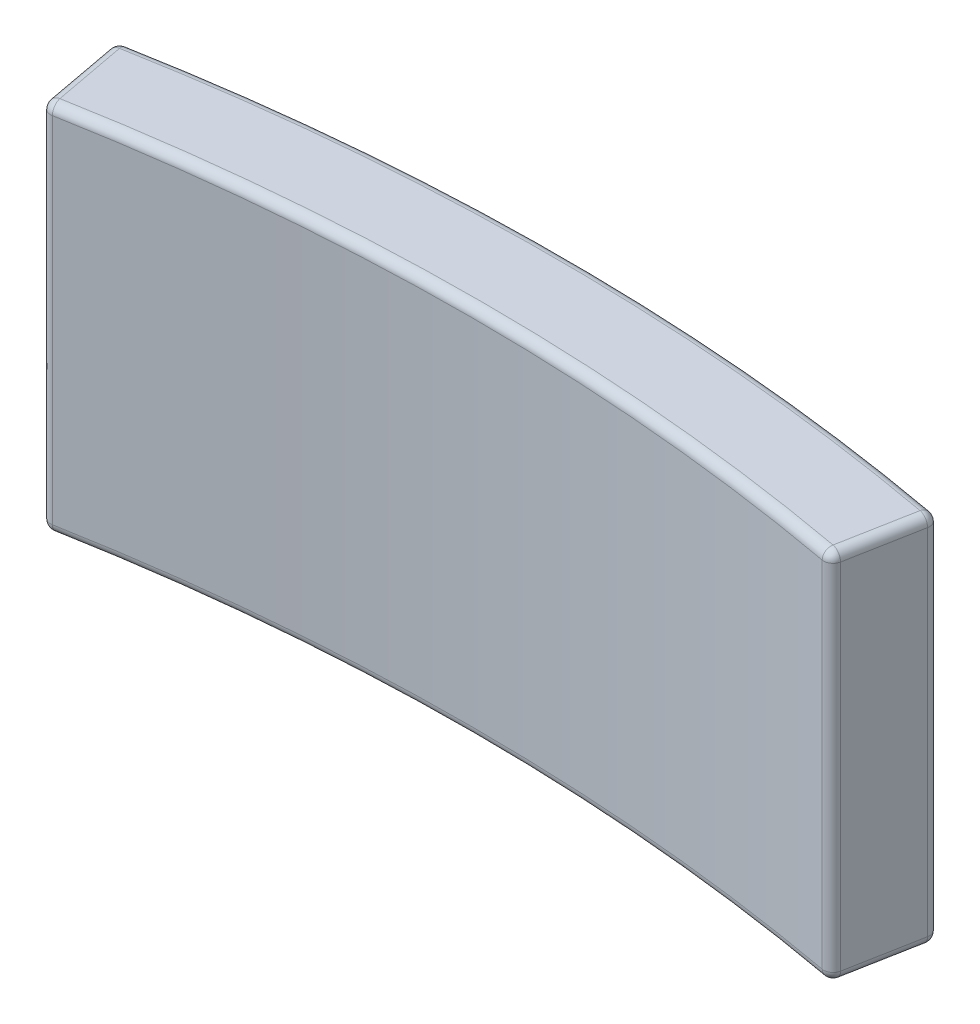
ISO-10303-21;
HEADER;
FILE_DESCRIPTION(('STEP AP214'),'2;1');
FILE_NAME('part.step','',(''),(''),'','','');
FILE_SCHEMA(('AUTOMOTIVE_DESIGN { 1 0 10303 214 1 1 1 1 }'));
ENDSEC;
DATA;
#1=APPLICATION_CONTEXT('core data for automotive mechanical design processes');
#2=APPLICATION_PROTOCOL_DEFINITION('international standard','automotive_design',2000,#1);
#3=PRODUCT_CONTEXT('',#1,'mechanical');
#4=PRODUCT('Part','Part','',(#3));
#5=PRODUCT_RELATED_PRODUCT_CATEGORY('part','',(#4));
#6=PRODUCT_DEFINITION_FORMATION('','',#4);
#7=PRODUCT_DEFINITION_CONTEXT('part definition',#1,'design');
#8=PRODUCT_DEFINITION('design','',#6,#7);
#9=PRODUCT_DEFINITION_SHAPE('','',#8);
#10=(LENGTH_UNIT() NAMED_UNIT(*) SI_UNIT(.MILLI.,.METRE.));
#11=(NAMED_UNIT(*) PLANE_ANGLE_UNIT() SI_UNIT($,.RADIAN.));
#12=(NAMED_UNIT(*) SI_UNIT($,.STERADIAN.) SOLID_ANGLE_UNIT());
#13=UNCERTAINTY_MEASURE_WITH_UNIT(LENGTH_MEASURE(1.E-05),#10,'distance_accuracy_value','');
#14=(GEOMETRIC_REPRESENTATION_CONTEXT(3) GLOBAL_UNCERTAINTY_ASSIGNED_CONTEXT((#13)) GLOBAL_UNIT_ASSIGNED_CONTEXT((#10,
#11,#12)) REPRESENTATION_CONTEXT('',''));
#15=CARTESIAN_POINT('',(0.,0.,0.));
#16=DIRECTION('',(0.,0.,1.));
#17=DIRECTION('',(1.,0.,0.));
#18=AXIS2_PLACEMENT_3D('',#15,#16,#17);
#19=CARTESIAN_POINT('',(0.,2.,0.));
#20=DIRECTION('',(0.,-1.,0.));
#21=DIRECTION('',(0.,0.,-1.));
#22=AXIS2_PLACEMENT_3D('',#19,#20,#21);
#23=CYLINDRICAL_SURFACE('',#22,24.);
#24=CARTESIAN_POINT('',(0.,1.9,0.));
#25=DIRECTION('',(0.,1.,0.));
#26=DIRECTION('',(0.,0.,1.));
#27=AXIS2_PLACEMENT_3D('',#24,#25,#26);
#28=CIRCLE('',#27,24.);
#29=CARTESIAN_POINT('',(-4.31124122948053,1.9,-23.6095997225965));
#30=VERTEX_POINT('',#29);
#31=CARTESIAN_POINT('',(4.31124122948052,1.9,-23.6095997225965));
#32=VERTEX_POINT('',#31);
#33=EDGE_CURVE('E41',#30,#32,#28,.F.);
#34=ORIENTED_EDGE('',*,*,#33,.T.);
#35=DIRECTION('',(0.,-1.,0.));
#36=VECTOR('',#35,1.);
#37=CARTESIAN_POINT('',(4.31124122948052,2.,-23.6095997225965));
#38=LINE('',#37,#36);
#39=CARTESIAN_POINT('',(4.31124122948052,-1.9,-23.6095997225965));
#40=VERTEX_POINT('',#39);
#41=EDGE_CURVE('E11',#32,#40,#38,.T.);
#42=ORIENTED_EDGE('',*,*,#41,.T.);
#43=CARTESIAN_POINT('',(0.,-1.9,0.));
#44=DIRECTION('',(0.,1.,0.));
#45=DIRECTION('',(0.,0.,1.));
#46=AXIS2_PLACEMENT_3D('',#43,#44,#45);
#47=CIRCLE('',#46,24.);
#48=CARTESIAN_POINT('',(-4.31124122948053,-1.9,-23.6095997225965));
#49=VERTEX_POINT('',#48);
#50=EDGE_CURVE('E244',#40,#49,#47,.T.);
#51=ORIENTED_EDGE('',*,*,#50,.T.);
#52=DIRECTION('',(0.,-1.,0.));
#53=VECTOR('',#52,1.);
#54=CARTESIAN_POINT('',(-4.31124122948053,2.,-23.6095997225965));
#55=LINE('',#54,#53);
#56=EDGE_CURVE('E52',#49,#30,#55,.F.);
#57=ORIENTED_EDGE('',*,*,#56,.T.);
#58=EDGE_LOOP('',(#34,#42,#51,#57));
#59=FACE_BOUND('',#58,.T.);
#60=ADVANCED_FACE('F32',(#59),#23,.T.);
#61=CARTESIAN_POINT('',(-4.22623890978113,2.,-22.6083812927297));
#62=DIRECTION('',(0.982973099683901,0.,-0.183749517816575));
#63=DIRECTION('',(-0.183749517816575,0.,-0.982973099683901));
#64=AXIS2_PLACEMENT_3D('',#61,#62,#63);
#65=PLANE('',#64);
#66=DIRECTION('',(0.183749517816575,0.,0.982973099683901));
#67=VECTOR('',#66,1.);
#68=CARTESIAN_POINT('',(-4.22623890978113,-1.9,-22.6083812927297));
#69=LINE('',#68,#67);
#70=CARTESIAN_POINT('',(-4.39157503432608,-1.9,-23.4928514386373));
#71=VERTEX_POINT('',#70);
#72=CARTESIAN_POINT('',(-4.24457408875354,-1.9,-22.7064658369611));
#73=VERTEX_POINT('',#72);
#74=EDGE_CURVE('E217',#71,#73,#69,.T.);
#75=ORIENTED_EDGE('',*,*,#74,.T.);
#76=DIRECTION('',(0.,-1.,0.));
#77=VECTOR('',#76,1.);
#78=CARTESIAN_POINT('',(-4.24457408875354,2.,-22.7064658369611));
#79=LINE('',#78,#77);
#80=CARTESIAN_POINT('',(-4.24457408875354,1.9,-22.7064658369611));
#81=VERTEX_POINT('',#80);
#82=EDGE_CURVE('E225',#73,#81,#79,.F.);
#83=ORIENTED_EDGE('',*,*,#82,.T.);
#84=DIRECTION('',(0.183749517816575,0.,0.982973099683901));
#85=VECTOR('',#84,1.);
#86=CARTESIAN_POINT('',(-4.40998842759771,1.9,-23.5913543924136));
#87=LINE('',#86,#85);
#88=CARTESIAN_POINT('',(-4.39157503432608,1.9,-23.4928514386373));
#89=VERTEX_POINT('',#88);
#90=EDGE_CURVE('E214',#81,#89,#87,.F.);
#91=ORIENTED_EDGE('',*,*,#90,.T.);
#92=DIRECTION('',(0.,-1.,0.));
#93=VECTOR('',#92,1.);
#94=CARTESIAN_POINT('',(-4.39157503432608,2.,-23.4928514386373));
#95=LINE('',#94,#93);
#96=EDGE_CURVE('E211',#89,#71,#95,.T.);
#97=ORIENTED_EDGE('',*,*,#96,.T.);
#98=EDGE_LOOP('',(#75,#83,#91,#97));
#99=FACE_BOUND('',#98,.T.);
#100=ADVANCED_FACE('F328',(#99),#65,.F.);
#101=CARTESIAN_POINT('',(0.,2.,0.));
#102=DIRECTION('',(0.,-1.,0.));
#103=DIRECTION('',(0.,0.,-1.));
#104=AXIS2_PLACEMENT_3D('',#101,#102,#103);
#105=CYLINDRICAL_SURFACE('',#104,23.);
#106=DIRECTION('',(0.,-1.,0.));
#107=VECTOR('',#106,1.);
#108=CARTESIAN_POINT('',(-4.12832752866054,2.,-22.6264648545924));
#109=LINE('',#108,#107);
#110=CARTESIAN_POINT('',(-4.12832752866054,1.9,-22.6264648545924));
#111=VERTEX_POINT('',#110);
#112=CARTESIAN_POINT('',(-4.12832752866054,-1.9,-22.6264648545924));
#113=VERTEX_POINT('',#112);
#114=EDGE_CURVE('E130',#111,#113,#109,.T.);
#115=ORIENTED_EDGE('',*,*,#114,.T.);
#116=CARTESIAN_POINT('',(0.,-1.9,0.));
#117=DIRECTION('',(0.,1.,0.));
#118=DIRECTION('',(0.,0.,1.));
#119=AXIS2_PLACEMENT_3D('',#116,#117,#118);
#120=CIRCLE('',#119,23.);
#121=CARTESIAN_POINT('',(4.12832752866054,-1.9,-22.6264648545924));
#122=VERTEX_POINT('',#121);
#123=EDGE_CURVE('E126',#113,#122,#120,.F.);
#124=ORIENTED_EDGE('',*,*,#123,.T.);
#125=DIRECTION('',(0.,-1.,0.));
#126=VECTOR('',#125,1.);
#127=CARTESIAN_POINT('',(4.12832752866054,2.,-22.6264648545924));
#128=LINE('',#127,#126);
#129=CARTESIAN_POINT('',(4.12832752866054,1.9,-22.6264648545924));
#130=VERTEX_POINT('',#129);
#131=EDGE_CURVE('E120',#122,#130,#128,.F.);
#132=ORIENTED_EDGE('',*,*,#131,.T.);
#133=CARTESIAN_POINT('',(0.,1.9,0.));
#134=DIRECTION('',(0.,1.,0.));
#135=DIRECTION('',(0.,0.,1.));
#136=AXIS2_PLACEMENT_3D('',#133,#134,#135);
#137=CIRCLE('',#136,23.);
#138=EDGE_CURVE('E123',#130,#111,#137,.T.);
#139=ORIENTED_EDGE('',*,*,#138,.T.);
#140=EDGE_LOOP('',(#115,#124,#132,#139));
#141=FACE_BOUND('',#140,.T.);
#142=ADVANCED_FACE('F122',(#141),#105,.F.);
#143=CARTESIAN_POINT('',(4.22623890978113,2.,-22.6083812927297));
#144=DIRECTION('',(-0.982973099683903,0.,-0.183749517816565));
#145=DIRECTION('',(-0.183749517816565,0.,0.982973099683903));
#146=AXIS2_PLACEMENT_3D('',#143,#144,#145);
#147=PLANE('',#146);
#148=DIRECTION('',(0.183749517816565,0.,-0.982973099683903));
#149=VECTOR('',#148,1.);
#150=CARTESIAN_POINT('',(4.22623890978113,1.9,-22.6083812927297));
#151=LINE('',#150,#149);
#152=CARTESIAN_POINT('',(4.39157503432608,1.9,-23.4928514386373));
#153=VERTEX_POINT('',#152);
#154=CARTESIAN_POINT('',(4.24457408875355,1.9,-22.7064658369611));
#155=VERTEX_POINT('',#154);
#156=EDGE_CURVE('E230',#153,#155,#151,.F.);
#157=ORIENTED_EDGE('',*,*,#156,.T.);
#158=DIRECTION('',(0.,-1.,0.));
#159=VECTOR('',#158,1.);
#160=CARTESIAN_POINT('',(4.24457408875355,2.,-22.7064658369611));
#161=LINE('',#160,#159);
#162=CARTESIAN_POINT('',(4.24457408875355,-1.9,-22.7064658369611));
#163=VERTEX_POINT('',#162);
#164=EDGE_CURVE('E153',#155,#163,#161,.T.);
#165=ORIENTED_EDGE('',*,*,#164,.T.);
#166=DIRECTION('',(0.183749517816565,0.,-0.982973099683903));
#167=VECTOR('',#166,1.);
#168=CARTESIAN_POINT('',(4.22623890978113,-1.9,-22.6083812927297));
#169=LINE('',#168,#167);
#170=CARTESIAN_POINT('',(4.39157503432608,-1.9,-23.4928514386373));
#171=VERTEX_POINT('',#170);
#172=EDGE_CURVE('E232',#163,#171,#169,.T.);
#173=ORIENTED_EDGE('',*,*,#172,.T.);
#174=DIRECTION('',(0.,-1.,0.));
#175=VECTOR('',#174,1.);
#176=CARTESIAN_POINT('',(4.39157503432608,2.,-23.4928514386373));
#177=LINE('',#176,#175);
#178=EDGE_CURVE('E228',#171,#153,#177,.F.);
#179=ORIENTED_EDGE('',*,*,#178,.T.);
#180=EDGE_LOOP('',(#157,#165,#173,#179));
#181=FACE_BOUND('',#180,.T.);
#182=ADVANCED_FACE('F287',(#181),#147,.F.);
#183=CARTESIAN_POINT('',(0.,2.,0.));
#184=DIRECTION('',(0.,1.,0.));
#185=DIRECTION('',(0.,0.,1.));
#186=AXIS2_PLACEMENT_3D('',#183,#184,#185);
#187=PLANE('',#186);
#188=CARTESIAN_POINT('',(0.,2.,0.));
#189=DIRECTION('',(0.,1.,0.));
#190=DIRECTION('',(0.,0.,1.));
#191=AXIS2_PLACEMENT_3D('',#188,#189,#190);
#192=CIRCLE('',#191,23.1);
#193=CARTESIAN_POINT('',(-4.14627677878515,2.,-22.7248407887428));
#194=VERTEX_POINT('',#193);
#195=CARTESIAN_POINT('',(4.14627677878516,2.,-22.7248407887428));
#196=VERTEX_POINT('',#195);
#197=EDGE_CURVE('E239',#194,#196,#192,.F.);
#198=ORIENTED_EDGE('',*,*,#197,.T.);
#199=DIRECTION('',(0.183749517816565,0.,-0.982973099683903));
#200=VECTOR('',#199,1.);
#201=CARTESIAN_POINT('',(4.31169111762931,2.,-23.6097293441953));
#202=LINE('',#201,#200);
#203=CARTESIAN_POINT('',(4.29327772435769,2.,-23.511226390419));
#204=VERTEX_POINT('',#203);
#205=EDGE_CURVE('E241',#196,#204,#202,.T.);
#206=ORIENTED_EDGE('',*,*,#205,.T.);
#207=CARTESIAN_POINT('',(0.,2.,0.));
#208=DIRECTION('',(0.,1.,0.));
#209=DIRECTION('',(0.,0.,1.));
#210=AXIS2_PLACEMENT_3D('',#207,#208,#209);
#211=CIRCLE('',#210,23.9);
#212=CARTESIAN_POINT('',(-4.29327772435769,2.,-23.511226390419));
#213=VERTEX_POINT('',#212);
#214=EDGE_CURVE('E235',#204,#213,#211,.T.);
#215=ORIENTED_EDGE('',*,*,#214,.T.);
#216=DIRECTION('',(0.183749517816575,0.,0.982973099683901));
#217=VECTOR('',#216,1.);
#218=CARTESIAN_POINT('',(-4.12794159981274,2.,-22.6267562445114));
#219=LINE('',#218,#217);
#220=EDGE_CURVE('E237',#213,#194,#219,.T.);
#221=ORIENTED_EDGE('',*,*,#220,.T.);
#222=EDGE_LOOP('',(#198,#206,#215,#221));
#223=FACE_BOUND('',#222,.T.);
#224=ADVANCED_FACE('F293',(#223),#187,.T.);
#225=CARTESIAN_POINT('',(0.,-2.,0.));
#226=DIRECTION('',(0.,1.,0.));
#227=DIRECTION('',(0.,0.,1.));
#228=AXIS2_PLACEMENT_3D('',#225,#226,#227);
#229=PLANE('',#228);
#230=DIRECTION('',(0.183749517816565,0.,-0.982973099683903));
#231=VECTOR('',#230,1.);
#232=CARTESIAN_POINT('',(-0.0982973099682618,-2.,-0.0183749517816325));
#233=LINE('',#232,#231);
#234=CARTESIAN_POINT('',(4.29327772435769,-2.,-23.511226390419));
#235=VERTEX_POINT('',#234);
#236=CARTESIAN_POINT('',(4.14627677878516,-2.,-22.7248407887428));
#237=VERTEX_POINT('',#236);
#238=EDGE_CURVE('E271',#235,#237,#233,.F.);
#239=ORIENTED_EDGE('',*,*,#238,.T.);
#240=CARTESIAN_POINT('',(0.,-2.,0.));
#241=DIRECTION('',(0.,1.,0.));
#242=DIRECTION('',(0.,0.,1.));
#243=AXIS2_PLACEMENT_3D('',#240,#241,#242);
#244=CIRCLE('',#243,23.1);
#245=CARTESIAN_POINT('',(-4.14627677878515,-2.,-22.7248407887428));
#246=VERTEX_POINT('',#245);
#247=EDGE_CURVE('E215',#237,#246,#244,.T.);
#248=ORIENTED_EDGE('',*,*,#247,.T.);
#249=DIRECTION('',(0.183749517816575,0.,0.982973099683901));
#250=VECTOR('',#249,1.);
#251=CARTESIAN_POINT('',(0.0982973099684756,-2.,-0.0183749517816734));
#252=LINE('',#251,#250);
#253=CARTESIAN_POINT('',(-4.29327772435769,-2.,-23.511226390419));
#254=VERTEX_POINT('',#253);
#255=EDGE_CURVE('E220',#246,#254,#252,.F.);
#256=ORIENTED_EDGE('',*,*,#255,.T.);
#257=CARTESIAN_POINT('',(0.,-2.,0.));
#258=DIRECTION('',(0.,1.,0.));
#259=DIRECTION('',(0.,0.,1.));
#260=AXIS2_PLACEMENT_3D('',#257,#258,#259);
#261=CIRCLE('',#260,23.9);
#262=EDGE_CURVE('E305',#254,#235,#261,.F.);
#263=ORIENTED_EDGE('',*,*,#262,.T.);
#264=EDGE_LOOP('',(#239,#248,#256,#263));
#265=FACE_BOUND('',#264,.T.);
#266=ADVANCED_FACE('F273',(#265),#229,.F.);
#267=CARTESIAN_POINT('',(0.,1.9,0.));
#268=DIRECTION('',(0.,1.,0.));
#269=DIRECTION('',(0.,0.,1.));
#270=AXIS2_PLACEMENT_3D('',#267,#268,#269);
#271=TOROIDAL_SURFACE('',#270,23.9,0.1);
#272=CARTESIAN_POINT('',(-4.29327772435769,1.9,-23.511226390419));
#273=DIRECTION('',(-0.983733321774852,0.,0.179635051228358));
#274=DIRECTION('',(0.179635051228358,0.,0.983733321774852));
#275=AXIS2_PLACEMENT_3D('',#272,#273,#274);
#276=CIRCLE('',#275,0.1);
#277=EDGE_CURVE('E36',#213,#30,#276,.T.);
#278=ORIENTED_EDGE('',*,*,#277,.F.);
#279=ORIENTED_EDGE('',*,*,#214,.F.);
#280=CARTESIAN_POINT('',(4.29327772435769,1.9,-23.511226390419));
#281=DIRECTION('',(0.983733321774854,0.,0.179635051228352));
#282=DIRECTION('',(0.179635051228352,0.,-0.983733321774854));
#283=AXIS2_PLACEMENT_3D('',#280,#281,#282);
#284=CIRCLE('',#283,0.1);
#285=EDGE_CURVE('E192',#32,#204,#284,.T.);
#286=ORIENTED_EDGE('',*,*,#285,.F.);
#287=ORIENTED_EDGE('',*,*,#33,.F.);
#288=EDGE_LOOP('',(#278,#279,#286,#287));
#289=FACE_BOUND('',#288,.T.);
#290=ADVANCED_FACE('F34',(#289),#271,.T.);
#291=CARTESIAN_POINT('',(-4.29327772435769,1.9,-23.511226390419));
#292=DIRECTION('',(0.,0.,1.));
#293=DIRECTION('',(1.,0.,0.));
#294=AXIS2_PLACEMENT_3D('',#291,#292,#293);
#295=SPHERICAL_SURFACE('',#294,0.1);
#296=CARTESIAN_POINT('',(-4.29327772435769,1.9,-23.511226390419));
#297=DIRECTION('',(-0.183749517816585,0.,-0.982973099683899));
#298=DIRECTION('',(-0.982973099683899,0.,0.183749517816585));
#299=AXIS2_PLACEMENT_3D('',#296,#297,#298);
#300=CIRCLE('',#299,0.1);
#301=EDGE_CURVE('E187',#213,#89,#300,.F.);
#302=ORIENTED_EDGE('',*,*,#301,.F.);
#303=ORIENTED_EDGE('',*,*,#277,.T.);
#304=CARTESIAN_POINT('',(-4.29327772435769,1.9,-23.511226390419));
#305=DIRECTION('',(0.,1.,0.));
#306=DIRECTION('',(0.,0.,1.));
#307=AXIS2_PLACEMENT_3D('',#304,#305,#306);
#308=CIRCLE('',#307,0.1);
#309=EDGE_CURVE('E190',#89,#30,#308,.F.);
#310=ORIENTED_EDGE('',*,*,#309,.F.);
#311=EDGE_LOOP('',(#302,#303,#310));
#312=FACE_BOUND('',#311,.T.);
#313=ADVANCED_FACE('F203',(#312),#295,.T.);
#314=CARTESIAN_POINT('',(4.29327772435769,1.9,-23.511226390419));
#315=DIRECTION('',(0.,0.,1.));
#316=DIRECTION('',(1.,0.,0.));
#317=AXIS2_PLACEMENT_3D('',#314,#315,#316);
#318=SPHERICAL_SURFACE('',#317,0.1);
#319=CARTESIAN_POINT('',(4.29327772435769,1.9,-23.511226390419));
#320=DIRECTION('',(0.,1.,0.));
#321=DIRECTION('',(0.,0.,1.));
#322=AXIS2_PLACEMENT_3D('',#319,#320,#321);
#323=CIRCLE('',#322,0.1);
#324=EDGE_CURVE('E182',#32,#153,#323,.F.);
#325=ORIENTED_EDGE('',*,*,#324,.F.);
#326=ORIENTED_EDGE('',*,*,#285,.T.);
#327=CARTESIAN_POINT('',(4.29327772435769,1.9,-23.511226390419));
#328=DIRECTION('',(0.183749517816551,0.,-0.982973099683905));
#329=DIRECTION('',(-0.982973099683905,0.,-0.183749517816551));
#330=AXIS2_PLACEMENT_3D('',#327,#328,#329);
#331=CIRCLE('',#330,0.1);
#332=EDGE_CURVE('E185',#153,#204,#331,.F.);
#333=ORIENTED_EDGE('',*,*,#332,.F.);
#334=EDGE_LOOP('',(#325,#326,#333));
#335=FACE_BOUND('',#334,.T.);
#336=ADVANCED_FACE('F319',(#335),#318,.T.);
#337=CARTESIAN_POINT('',(-4.29327772435769,2.,-23.511226390419));
#338=DIRECTION('',(0.,-1.,0.));
#339=DIRECTION('',(0.,0.,-1.));
#340=AXIS2_PLACEMENT_3D('',#337,#338,#339);
#341=CYLINDRICAL_SURFACE('',#340,0.1);
#342=ORIENTED_EDGE('',*,*,#309,.T.);
#343=ORIENTED_EDGE('',*,*,#56,.F.);
#344=CARTESIAN_POINT('',(-4.29327772435769,-1.9,-23.511226390419));
#345=DIRECTION('',(0.,-1.,0.));
#346=DIRECTION('',(0.,0.,-1.));
#347=AXIS2_PLACEMENT_3D('',#344,#345,#346);
#348=CIRCLE('',#347,0.1);
#349=EDGE_CURVE('E176',#71,#49,#348,.T.);
#350=ORIENTED_EDGE('',*,*,#349,.F.);
#351=ORIENTED_EDGE('',*,*,#96,.F.);
#352=EDGE_LOOP('',(#342,#343,#350,#351));
#353=FACE_BOUND('',#352,.T.);
#354=ADVANCED_FACE('F208',(#353),#341,.T.);
#355=CARTESIAN_POINT('',(0.0982973099684765,1.9,-0.0183749517816736));
#356=DIRECTION('',(-0.183749517816575,0.,-0.982973099683901));
#357=DIRECTION('',(-0.982973099683901,0.,0.183749517816575));
#358=AXIS2_PLACEMENT_3D('',#355,#356,#357);
#359=CYLINDRICAL_SURFACE('',#358,0.1);
#360=ORIENTED_EDGE('',*,*,#301,.T.);
#361=ORIENTED_EDGE('',*,*,#90,.F.);
#362=CARTESIAN_POINT('',(-4.14627677878515,1.9,-22.7248407887428));
#363=DIRECTION('',(0.183749517816653,0.,0.982973099683886));
#364=DIRECTION('',(0.982973099683886,0.,-0.183749517816653));
#365=AXIS2_PLACEMENT_3D('',#362,#363,#364);
#366=CIRCLE('',#365,0.1);
#367=EDGE_CURVE('E173',#194,#81,#366,.T.);
#368=ORIENTED_EDGE('',*,*,#367,.F.);
#369=ORIENTED_EDGE('',*,*,#220,.F.);
#370=EDGE_LOOP('',(#360,#361,#368,#369));
#371=FACE_BOUND('',#370,.T.);
#372=ADVANCED_FACE('F297',(#371),#359,.T.);
#373=CARTESIAN_POINT('',(0.,1.9,0.));
#374=DIRECTION('',(0.,1.,0.));
#375=DIRECTION('',(0.,0.,1.));
#376=AXIS2_PLACEMENT_3D('',#373,#374,#375);
#377=TOROIDAL_SURFACE('',#376,23.1,0.1);
#378=CARTESIAN_POINT('',(4.14627677878516,1.9,-22.7248407887428));
#379=DIRECTION('',(0.983759341504014,0.,0.179492501246119));
#380=DIRECTION('',(0.179492501246119,0.,-0.983759341504015));
#381=AXIS2_PLACEMENT_3D('',#378,#379,#380);
#382=CIRCLE('',#381,0.1);
#383=EDGE_CURVE('E137',#196,#130,#382,.T.);
#384=ORIENTED_EDGE('',*,*,#383,.F.);
#385=ORIENTED_EDGE('',*,*,#197,.F.);
#386=CARTESIAN_POINT('',(-4.14627677878515,1.9,-22.7248407887428));
#387=DIRECTION('',(-0.983759341504016,0.,0.17949250124611));
#388=DIRECTION('',(0.17949250124611,0.,0.983759341504016));
#389=AXIS2_PLACEMENT_3D('',#386,#387,#388);
#390=CIRCLE('',#389,0.1);
#391=EDGE_CURVE('E140',#111,#194,#390,.T.);
#392=ORIENTED_EDGE('',*,*,#391,.F.);
#393=ORIENTED_EDGE('',*,*,#138,.F.);
#394=EDGE_LOOP('',(#384,#385,#392,#393));
#395=FACE_BOUND('',#394,.T.);
#396=ADVANCED_FACE('F135',(#395),#377,.T.);
#397=CARTESIAN_POINT('',(-0.0982973099682618,1.9,-0.0183749517816325));
#398=DIRECTION('',(-0.183749517816565,0.,0.982973099683903));
#399=DIRECTION('',(0.982973099683903,0.,0.183749517816565));
#400=AXIS2_PLACEMENT_3D('',#397,#398,#399);
#401=CYLINDRICAL_SURFACE('',#400,0.1);
#402=ORIENTED_EDGE('',*,*,#332,.T.);
#403=ORIENTED_EDGE('',*,*,#205,.F.);
#404=CARTESIAN_POINT('',(4.14627677878516,1.9,-22.7248407887428));
#405=DIRECTION('',(-0.183749517816551,0.,0.982973099683905));
#406=DIRECTION('',(0.982973099683905,0.,0.183749517816551));
#407=AXIS2_PLACEMENT_3D('',#404,#405,#406);
#408=CIRCLE('',#407,0.1);
#409=EDGE_CURVE('E149',#155,#196,#408,.T.);
#410=ORIENTED_EDGE('',*,*,#409,.F.);
#411=ORIENTED_EDGE('',*,*,#156,.F.);
#412=EDGE_LOOP('',(#402,#403,#410,#411));
#413=FACE_BOUND('',#412,.T.);
#414=ADVANCED_FACE('F291',(#413),#401,.T.);
#415=CARTESIAN_POINT('',(4.29327772435769,2.,-23.511226390419));
#416=DIRECTION('',(0.,-1.,0.));
#417=DIRECTION('',(0.,0.,-1.));
#418=AXIS2_PLACEMENT_3D('',#415,#416,#417);
#419=CYLINDRICAL_SURFACE('',#418,0.1);
#420=ORIENTED_EDGE('',*,*,#324,.T.);
#421=ORIENTED_EDGE('',*,*,#178,.F.);
#422=CARTESIAN_POINT('',(4.29327772435769,-1.9,-23.511226390419));
#423=DIRECTION('',(0.,-1.,0.));
#424=DIRECTION('',(0.,0.,-1.));
#425=AXIS2_PLACEMENT_3D('',#422,#423,#424);
#426=CIRCLE('',#425,0.1);
#427=EDGE_CURVE('E168',#40,#171,#426,.T.);
#428=ORIENTED_EDGE('',*,*,#427,.F.);
#429=ORIENTED_EDGE('',*,*,#41,.F.);
#430=EDGE_LOOP('',(#420,#421,#428,#429));
#431=FACE_BOUND('',#430,.T.);
#432=ADVANCED_FACE('F318',(#431),#419,.T.);
#433=CARTESIAN_POINT('',(0.,-1.9,0.));
#434=DIRECTION('',(0.,1.,0.));
#435=DIRECTION('',(0.,0.,1.));
#436=AXIS2_PLACEMENT_3D('',#433,#434,#435);
#437=TOROIDAL_SURFACE('',#436,23.9,0.1);
#438=CARTESIAN_POINT('',(-4.29327772435769,-1.9,-23.511226390419));
#439=DIRECTION('',(-0.983733321774854,0.,0.179635051228352));
#440=DIRECTION('',(0.179635051228352,0.,0.983733321774854));
#441=AXIS2_PLACEMENT_3D('',#438,#439,#440);
#442=CIRCLE('',#441,0.1);
#443=EDGE_CURVE('E179',#49,#254,#442,.T.);
#444=ORIENTED_EDGE('',*,*,#443,.F.);
#445=ORIENTED_EDGE('',*,*,#50,.F.);
#446=CARTESIAN_POINT('',(4.29327772435769,-1.9,-23.511226390419));
#447=DIRECTION('',(0.983733321774854,0.,0.179635051228352));
#448=DIRECTION('',(0.179635051228352,0.,-0.983733321774854));
#449=AXIS2_PLACEMENT_3D('',#446,#447,#448);
#450=CIRCLE('',#449,0.1);
#451=EDGE_CURVE('E166',#235,#40,#450,.T.);
#452=ORIENTED_EDGE('',*,*,#451,.F.);
#453=ORIENTED_EDGE('',*,*,#262,.F.);
#454=EDGE_LOOP('',(#444,#445,#452,#453));
#455=FACE_BOUND('',#454,.T.);
#456=ADVANCED_FACE('F312',(#455),#437,.T.);
#457=CARTESIAN_POINT('',(-4.29327772435769,-1.9,-23.511226390419));
#458=DIRECTION('',(0.,0.,1.));
#459=DIRECTION('',(1.,0.,0.));
#460=AXIS2_PLACEMENT_3D('',#457,#458,#459);
#461=SPHERICAL_SURFACE('',#460,0.1);
#462=ORIENTED_EDGE('',*,*,#349,.T.);
#463=ORIENTED_EDGE('',*,*,#443,.T.);
#464=CARTESIAN_POINT('',(-4.29327772435769,-1.9,-23.511226390419));
#465=DIRECTION('',(-0.183749517816585,0.,-0.982973099683899));
#466=DIRECTION('',(-0.982973099683899,0.,0.183749517816585));
#467=AXIS2_PLACEMENT_3D('',#464,#465,#466);
#468=CIRCLE('',#467,0.1);
#469=EDGE_CURVE('E157',#71,#254,#468,.F.);
#470=ORIENTED_EDGE('',*,*,#469,.F.);
#471=EDGE_LOOP('',(#462,#463,#470));
#472=FACE_BOUND('',#471,.T.);
#473=ADVANCED_FACE('F356',(#472),#461,.T.);
#474=CARTESIAN_POINT('',(-4.14627677878515,1.9,-22.7248407887428));
#475=DIRECTION('',(0.,0.,1.));
#476=DIRECTION('',(1.,0.,0.));
#477=AXIS2_PLACEMENT_3D('',#474,#475,#476);
#478=SPHERICAL_SURFACE('',#477,0.1);
#479=ORIENTED_EDGE('',*,*,#391,.T.);
#480=ORIENTED_EDGE('',*,*,#367,.T.);
#481=CARTESIAN_POINT('',(-4.14627677878515,1.9,-22.7248407887428));
#482=DIRECTION('',(0.,1.,0.));
#483=DIRECTION('',(0.,0.,1.));
#484=AXIS2_PLACEMENT_3D('',#481,#482,#483);
#485=CIRCLE('',#484,0.1);
#486=EDGE_CURVE('E154',#111,#81,#485,.F.);
#487=ORIENTED_EDGE('',*,*,#486,.F.);
#488=EDGE_LOOP('',(#479,#480,#487));
#489=FACE_BOUND('',#488,.T.);
#490=ADVANCED_FACE('F299',(#489),#478,.T.);
#491=CARTESIAN_POINT('',(4.14627677878516,1.9,-22.7248407887428));
#492=DIRECTION('',(0.,0.,1.));
#493=DIRECTION('',(1.,0.,0.));
#494=AXIS2_PLACEMENT_3D('',#491,#492,#493);
#495=SPHERICAL_SURFACE('',#494,0.1);
#496=ORIENTED_EDGE('',*,*,#409,.T.);
#497=ORIENTED_EDGE('',*,*,#383,.T.);
#498=CARTESIAN_POINT('',(4.14627677878515,1.9,-22.7248407887428));
#499=DIRECTION('',(0.,1.,0.));
#500=DIRECTION('',(0.,0.,1.));
#501=AXIS2_PLACEMENT_3D('',#498,#499,#500);
#502=CIRCLE('',#501,0.1);
#503=EDGE_CURVE('E146',#155,#130,#502,.F.);
#504=ORIENTED_EDGE('',*,*,#503,.F.);
#505=EDGE_LOOP('',(#496,#497,#504));
#506=FACE_BOUND('',#505,.T.);
#507=ADVANCED_FACE('F145',(#506),#495,.T.);
#508=CARTESIAN_POINT('',(4.29327772435769,-1.9,-23.511226390419));
#509=DIRECTION('',(0.,0.,1.));
#510=DIRECTION('',(1.,0.,0.));
#511=AXIS2_PLACEMENT_3D('',#508,#509,#510);
#512=SPHERICAL_SURFACE('',#511,0.1);
#513=ORIENTED_EDGE('',*,*,#451,.T.);
#514=ORIENTED_EDGE('',*,*,#427,.T.);
#515=CARTESIAN_POINT('',(4.29327772435769,-1.9,-23.511226390419));
#516=DIRECTION('',(0.183749517816551,0.,-0.982973099683905));
#517=DIRECTION('',(-0.982973099683905,0.,-0.183749517816551));
#518=AXIS2_PLACEMENT_3D('',#515,#516,#517);
#519=CIRCLE('',#518,0.1);
#520=EDGE_CURVE('E155',#235,#171,#519,.F.);
#521=ORIENTED_EDGE('',*,*,#520,.F.);
#522=EDGE_LOOP('',(#513,#514,#521));
#523=FACE_BOUND('',#522,.T.);
#524=ADVANCED_FACE('F315',(#523),#512,.T.);
#525=CARTESIAN_POINT('',(-4.12794159981274,-1.9,-22.6267562445114));
#526=DIRECTION('',(0.183749517816575,0.,0.982973099683901));
#527=DIRECTION('',(0.982973099683901,0.,-0.183749517816575));
#528=AXIS2_PLACEMENT_3D('',#525,#526,#527);
#529=CYLINDRICAL_SURFACE('',#528,0.1);
#530=ORIENTED_EDGE('',*,*,#469,.T.);
#531=ORIENTED_EDGE('',*,*,#255,.F.);
#532=CARTESIAN_POINT('',(-4.14627677878515,-1.9,-22.7248407887428));
#533=DIRECTION('',(0.183749517816585,0.,0.982973099683899));
#534=DIRECTION('',(0.982973099683899,0.,-0.183749517816585));
#535=AXIS2_PLACEMENT_3D('',#532,#533,#534);
#536=CIRCLE('',#535,0.1);
#537=EDGE_CURVE('E160',#73,#246,#536,.T.);
#538=ORIENTED_EDGE('',*,*,#537,.F.);
#539=ORIENTED_EDGE('',*,*,#74,.F.);
#540=EDGE_LOOP('',(#530,#531,#538,#539));
#541=FACE_BOUND('',#540,.T.);
#542=ADVANCED_FACE('F268',(#541),#529,.T.);
#543=CARTESIAN_POINT('',(-4.14627677878515,2.,-22.7248407887428));
#544=DIRECTION('',(0.,-1.,0.));
#545=DIRECTION('',(0.,0.,-1.));
#546=AXIS2_PLACEMENT_3D('',#543,#544,#545);
#547=CYLINDRICAL_SURFACE('',#546,0.1);
#548=ORIENTED_EDGE('',*,*,#486,.T.);
#549=ORIENTED_EDGE('',*,*,#82,.F.);
#550=CARTESIAN_POINT('',(-4.14627677878515,-1.9,-22.7248407887428));
#551=DIRECTION('',(0.,-1.,0.));
#552=DIRECTION('',(0.,0.,-1.));
#553=AXIS2_PLACEMENT_3D('',#550,#551,#552);
#554=CIRCLE('',#553,0.1);
#555=EDGE_CURVE('E257',#113,#73,#554,.T.);
#556=ORIENTED_EDGE('',*,*,#555,.F.);
#557=ORIENTED_EDGE('',*,*,#114,.F.);
#558=EDGE_LOOP('',(#548,#549,#556,#557));
#559=FACE_BOUND('',#558,.T.);
#560=ADVANCED_FACE('F303',(#559),#547,.T.);
#561=CARTESIAN_POINT('',(4.14627677878516,2.,-22.7248407887428));
#562=DIRECTION('',(0.,-1.,0.));
#563=DIRECTION('',(0.,0.,-1.));
#564=AXIS2_PLACEMENT_3D('',#561,#562,#563);
#565=CYLINDRICAL_SURFACE('',#564,0.1);
#566=ORIENTED_EDGE('',*,*,#503,.T.);
#567=ORIENTED_EDGE('',*,*,#131,.F.);
#568=CARTESIAN_POINT('',(4.14627677878516,-1.9,-22.7248407887428));
#569=DIRECTION('',(0.,-1.,0.));
#570=DIRECTION('',(0.,0.,-1.));
#571=AXIS2_PLACEMENT_3D('',#568,#569,#570);
#572=CIRCLE('',#571,0.1);
#573=EDGE_CURVE('E254',#163,#122,#572,.T.);
#574=ORIENTED_EDGE('',*,*,#573,.F.);
#575=ORIENTED_EDGE('',*,*,#164,.F.);
#576=EDGE_LOOP('',(#566,#567,#574,#575));
#577=FACE_BOUND('',#576,.T.);
#578=ADVANCED_FACE('F151',(#577),#565,.T.);
#579=CARTESIAN_POINT('',(4.12794159981274,-1.9,-22.6267562445114));
#580=DIRECTION('',(0.183749517816565,0.,-0.982973099683903));
#581=DIRECTION('',(-0.982973099683903,0.,-0.183749517816565));
#582=AXIS2_PLACEMENT_3D('',#579,#580,#581);
#583=CYLINDRICAL_SURFACE('',#582,0.1);
#584=ORIENTED_EDGE('',*,*,#520,.T.);
#585=ORIENTED_EDGE('',*,*,#172,.F.);
#586=CARTESIAN_POINT('',(4.14627677878516,-1.9,-22.7248407887428));
#587=DIRECTION('',(-0.183749517816516,0.,0.982973099683912));
#588=DIRECTION('',(0.982973099683912,0.,0.183749517816516));
#589=AXIS2_PLACEMENT_3D('',#586,#587,#588);
#590=CIRCLE('',#589,0.1);
#591=EDGE_CURVE('E252',#237,#163,#590,.T.);
#592=ORIENTED_EDGE('',*,*,#591,.F.);
#593=ORIENTED_EDGE('',*,*,#238,.F.);
#594=EDGE_LOOP('',(#584,#585,#592,#593));
#595=FACE_BOUND('',#594,.T.);
#596=ADVANCED_FACE('F283',(#595),#583,.T.);
#597=CARTESIAN_POINT('',(-4.14627677878515,-1.9,-22.7248407887428));
#598=DIRECTION('',(0.,0.,1.));
#599=DIRECTION('',(1.,0.,0.));
#600=AXIS2_PLACEMENT_3D('',#597,#598,#599);
#601=SPHERICAL_SURFACE('',#600,0.1);
#602=ORIENTED_EDGE('',*,*,#555,.T.);
#603=ORIENTED_EDGE('',*,*,#537,.T.);
#604=CARTESIAN_POINT('',(-4.14627677878515,-1.9,-22.7248407887428));
#605=DIRECTION('',(-0.983759341504017,0.,0.179492501246102));
#606=DIRECTION('',(0.179492501246102,0.,0.983759341504017));
#607=AXIS2_PLACEMENT_3D('',#604,#605,#606);
#608=CIRCLE('',#607,0.1);
#609=EDGE_CURVE('E250',#113,#246,#608,.F.);
#610=ORIENTED_EDGE('',*,*,#609,.F.);
#611=EDGE_LOOP('',(#602,#603,#610));
#612=FACE_BOUND('',#611,.T.);
#613=ADVANCED_FACE('F264',(#612),#601,.T.);
#614=CARTESIAN_POINT('',(4.14627677878516,-1.9,-22.7248407887428));
#615=DIRECTION('',(0.,0.,1.));
#616=DIRECTION('',(1.,0.,0.));
#617=AXIS2_PLACEMENT_3D('',#614,#615,#616);
#618=SPHERICAL_SURFACE('',#617,0.1);
#619=ORIENTED_EDGE('',*,*,#591,.T.);
#620=ORIENTED_EDGE('',*,*,#573,.T.);
#621=CARTESIAN_POINT('',(4.14627677878515,-1.9,-22.7248407887428));
#622=DIRECTION('',(0.983759341504016,0.,0.17949250124611));
#623=DIRECTION('',(0.17949250124611,0.,-0.983759341504016));
#624=AXIS2_PLACEMENT_3D('',#621,#622,#623);
#625=CIRCLE('',#624,0.1);
#626=EDGE_CURVE('E248',#237,#122,#625,.F.);
#627=ORIENTED_EDGE('',*,*,#626,.F.);
#628=EDGE_LOOP('',(#619,#620,#627));
#629=FACE_BOUND('',#628,.T.);
#630=ADVANCED_FACE('F280',(#629),#618,.T.);
#631=CARTESIAN_POINT('',(0.,-1.9,0.));
#632=DIRECTION('',(0.,1.,0.));
#633=DIRECTION('',(0.,0.,1.));
#634=AXIS2_PLACEMENT_3D('',#631,#632,#633);
#635=TOROIDAL_SURFACE('',#634,23.1,0.1);
#636=ORIENTED_EDGE('',*,*,#609,.T.);
#637=ORIENTED_EDGE('',*,*,#247,.F.);
#638=ORIENTED_EDGE('',*,*,#626,.T.);
#639=ORIENTED_EDGE('',*,*,#123,.F.);
#640=EDGE_LOOP('',(#636,#637,#638,#639));
#641=FACE_BOUND('',#640,.T.);
#642=ADVANCED_FACE('F278',(#641),#635,.T.);
#643=CLOSED_SHELL('',(#60,#100,#142,#182,#224,#266,#290,#313,#336,#354,#372,#396,#414,#432,#456,
#473,#490,#507,#524,#542,#560,#578,#596,#613,#630,#642));
#644=MANIFOLD_SOLID_BREP('B2',#643);
#645=ADVANCED_BREP_SHAPE_REPRESENTATION('',(#18,#644),#14);
#646=SHAPE_DEFINITION_REPRESENTATION(#9,#645);
ENDSEC;
END-ISO-10303-21;
